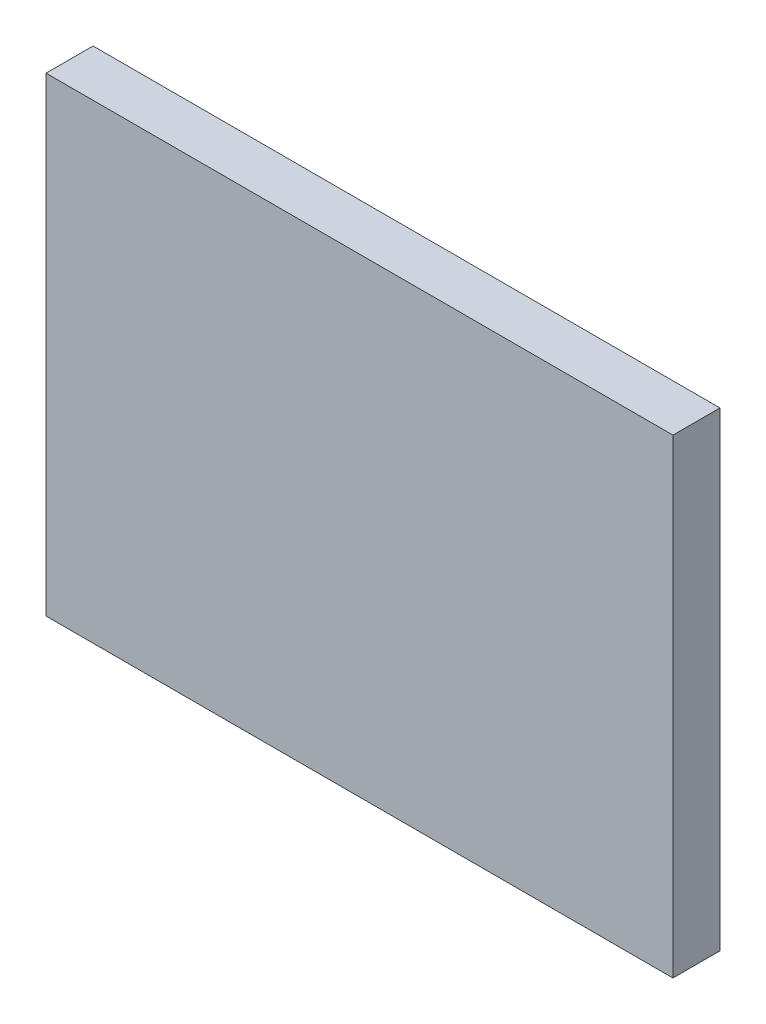
ISO-10303-21;
HEADER;
FILE_DESCRIPTION(('STEP AP214'),'2;1');
FILE_NAME('part.step','',(''),(''),'','','');
FILE_SCHEMA(('AUTOMOTIVE_DESIGN { 1 0 10303 214 1 1 1 1 }'));
ENDSEC;
DATA;
#1=APPLICATION_CONTEXT('core data for automotive mechanical design processes');
#2=APPLICATION_PROTOCOL_DEFINITION('international standard','automotive_design',2000,#1);
#3=PRODUCT_CONTEXT('',#1,'mechanical');
#4=PRODUCT('Part','Part','',(#3));
#5=PRODUCT_RELATED_PRODUCT_CATEGORY('part','',(#4));
#6=PRODUCT_DEFINITION_FORMATION('','',#4);
#7=PRODUCT_DEFINITION_CONTEXT('part definition',#1,'design');
#8=PRODUCT_DEFINITION('design','',#6,#7);
#9=PRODUCT_DEFINITION_SHAPE('','',#8);
#10=(LENGTH_UNIT() NAMED_UNIT(*) SI_UNIT(.MILLI.,.METRE.));
#11=(NAMED_UNIT(*) PLANE_ANGLE_UNIT() SI_UNIT($,.RADIAN.));
#12=(NAMED_UNIT(*) SI_UNIT($,.STERADIAN.) SOLID_ANGLE_UNIT());
#13=UNCERTAINTY_MEASURE_WITH_UNIT(LENGTH_MEASURE(1.E-05),#10,'distance_accuracy_value','');
#14=(GEOMETRIC_REPRESENTATION_CONTEXT(3) GLOBAL_UNCERTAINTY_ASSIGNED_CONTEXT((#13)) GLOBAL_UNIT_ASSIGNED_CONTEXT((#10,
#11,#12)) REPRESENTATION_CONTEXT('',''));
#15=CARTESIAN_POINT('',(0.,0.,0.));
#16=DIRECTION('',(0.,0.,1.));
#17=DIRECTION('',(1.,0.,0.));
#18=AXIS2_PLACEMENT_3D('',#15,#16,#17);
#19=CARTESIAN_POINT('',(-20.,-15.,3.));
#20=DIRECTION('',(1.,0.,0.));
#21=DIRECTION('',(0.,0.,-1.));
#22=AXIS2_PLACEMENT_3D('',#19,#20,#21);
#23=PLANE('',#22);
#24=DIRECTION('',(0.,-1.,0.));
#25=VECTOR('',#24,1.);
#26=CARTESIAN_POINT('',(-20.,-15.,0.));
#27=LINE('',#26,#25);
#28=CARTESIAN_POINT('',(-20.,15.,0.));
#29=VERTEX_POINT('',#28);
#30=CARTESIAN_POINT('',(-20.,-15.,0.));
#31=VERTEX_POINT('',#30);
#32=EDGE_CURVE('E102',#29,#31,#27,.T.);
#33=ORIENTED_EDGE('',*,*,#32,.T.);
#34=DIRECTION('',(0.,0.,-1.));
#35=VECTOR('',#34,1.);
#36=CARTESIAN_POINT('',(-20.,-15.,3.));
#37=LINE('',#36,#35);
#38=CARTESIAN_POINT('',(-20.,-15.,3.));
#39=VERTEX_POINT('',#38);
#40=EDGE_CURVE('E11',#39,#31,#37,.T.);
#41=ORIENTED_EDGE('',*,*,#40,.F.);
#42=DIRECTION('',(0.,-1.,0.));
#43=VECTOR('',#42,1.);
#44=CARTESIAN_POINT('',(-20.,-15.,3.));
#45=LINE('',#44,#43);
#46=CARTESIAN_POINT('',(-20.,15.,3.));
#47=VERTEX_POINT('',#46);
#48=EDGE_CURVE('E90',#47,#39,#45,.T.);
#49=ORIENTED_EDGE('',*,*,#48,.F.);
#50=DIRECTION('',(0.,0.,-1.));
#51=VECTOR('',#50,1.);
#52=CARTESIAN_POINT('',(-20.,15.,3.));
#53=LINE('',#52,#51);
#54=EDGE_CURVE('E98',#47,#29,#53,.T.);
#55=ORIENTED_EDGE('',*,*,#54,.T.);
#56=EDGE_LOOP('',(#33,#41,#49,#55));
#57=FACE_BOUND('',#56,.T.);
#58=ADVANCED_FACE('F39',(#57),#23,.F.);
#59=CARTESIAN_POINT('',(-20.,-15.,3.));
#60=DIRECTION('',(0.,1.,0.));
#61=DIRECTION('',(0.,0.,1.));
#62=AXIS2_PLACEMENT_3D('',#59,#60,#61);
#63=PLANE('',#62);
#64=DIRECTION('',(1.,0.,0.));
#65=VECTOR('',#64,1.);
#66=CARTESIAN_POINT('',(-20.,-15.,0.));
#67=LINE('',#66,#65);
#68=CARTESIAN_POINT('',(20.,-15.,0.));
#69=VERTEX_POINT('',#68);
#70=EDGE_CURVE('E94',#31,#69,#67,.T.);
#71=ORIENTED_EDGE('',*,*,#70,.T.);
#72=DIRECTION('',(0.,0.,-1.));
#73=VECTOR('',#72,1.);
#74=CARTESIAN_POINT('',(20.,-15.,3.));
#75=LINE('',#74,#73);
#76=CARTESIAN_POINT('',(20.,-15.,3.));
#77=VERTEX_POINT('',#76);
#78=EDGE_CURVE('E47',#77,#69,#75,.T.);
#79=ORIENTED_EDGE('',*,*,#78,.F.);
#80=DIRECTION('',(1.,0.,0.));
#81=VECTOR('',#80,1.);
#82=CARTESIAN_POINT('',(-20.,-15.,3.));
#83=LINE('',#82,#81);
#84=EDGE_CURVE('E85',#39,#77,#83,.T.);
#85=ORIENTED_EDGE('',*,*,#84,.F.);
#86=ORIENTED_EDGE('',*,*,#40,.T.);
#87=EDGE_LOOP('',(#71,#79,#85,#86));
#88=FACE_BOUND('',#87,.T.);
#89=ADVANCED_FACE('F93',(#88),#63,.F.);
#90=CARTESIAN_POINT('',(20.,-15.,3.));
#91=DIRECTION('',(-1.,0.,0.));
#92=DIRECTION('',(0.,0.,1.));
#93=AXIS2_PLACEMENT_3D('',#90,#91,#92);
#94=PLANE('',#93);
#95=DIRECTION('',(0.,1.,0.));
#96=VECTOR('',#95,1.);
#97=CARTESIAN_POINT('',(20.,-15.,0.));
#98=LINE('',#97,#96);
#99=CARTESIAN_POINT('',(20.,15.,0.));
#100=VERTEX_POINT('',#99);
#101=EDGE_CURVE('E72',#69,#100,#98,.T.);
#102=ORIENTED_EDGE('',*,*,#101,.T.);
#103=DIRECTION('',(0.,0.,-1.));
#104=VECTOR('',#103,1.);
#105=CARTESIAN_POINT('',(20.,15.,3.));
#106=LINE('',#105,#104);
#107=CARTESIAN_POINT('',(20.,15.,3.));
#108=VERTEX_POINT('',#107);
#109=EDGE_CURVE('E95',#108,#100,#106,.T.);
#110=ORIENTED_EDGE('',*,*,#109,.F.);
#111=DIRECTION('',(0.,1.,0.));
#112=VECTOR('',#111,1.);
#113=CARTESIAN_POINT('',(20.,-15.,3.));
#114=LINE('',#113,#112);
#115=EDGE_CURVE('E88',#77,#108,#114,.T.);
#116=ORIENTED_EDGE('',*,*,#115,.F.);
#117=ORIENTED_EDGE('',*,*,#78,.T.);
#118=EDGE_LOOP('',(#102,#110,#116,#117));
#119=FACE_BOUND('',#118,.T.);
#120=ADVANCED_FACE('F96',(#119),#94,.F.);
#121=CARTESIAN_POINT('',(-20.,15.,3.));
#122=DIRECTION('',(0.,-1.,0.));
#123=DIRECTION('',(0.,0.,-1.));
#124=AXIS2_PLACEMENT_3D('',#121,#122,#123);
#125=PLANE('',#124);
#126=DIRECTION('',(-1.,0.,0.));
#127=VECTOR('',#126,1.);
#128=CARTESIAN_POINT('',(-20.,15.,0.));
#129=LINE('',#128,#127);
#130=EDGE_CURVE('E78',#100,#29,#129,.T.);
#131=ORIENTED_EDGE('',*,*,#130,.T.);
#132=ORIENTED_EDGE('',*,*,#54,.F.);
#133=DIRECTION('',(-1.,0.,0.));
#134=VECTOR('',#133,1.);
#135=CARTESIAN_POINT('',(-20.,15.,3.));
#136=LINE('',#135,#134);
#137=EDGE_CURVE('E55',#108,#47,#136,.T.);
#138=ORIENTED_EDGE('',*,*,#137,.F.);
#139=ORIENTED_EDGE('',*,*,#109,.T.);
#140=EDGE_LOOP('',(#131,#132,#138,#139));
#141=FACE_BOUND('',#140,.T.);
#142=ADVANCED_FACE('F109',(#141),#125,.F.);
#143=CARTESIAN_POINT('',(0.,0.,3.));
#144=DIRECTION('',(0.,0.,-1.));
#145=DIRECTION('',(-1.,0.,0.));
#146=AXIS2_PLACEMENT_3D('',#143,#144,#145);
#147=PLANE('',#146);
#148=ORIENTED_EDGE('',*,*,#48,.T.);
#149=ORIENTED_EDGE('',*,*,#84,.T.);
#150=ORIENTED_EDGE('',*,*,#115,.T.);
#151=ORIENTED_EDGE('',*,*,#137,.T.);
#152=EDGE_LOOP('',(#148,#149,#150,#151));
#153=FACE_BOUND('',#152,.T.);
#154=ADVANCED_FACE('F86',(#153),#147,.F.);
#155=CARTESIAN_POINT('',(0.,0.,0.));
#156=DIRECTION('',(0.,0.,-1.));
#157=DIRECTION('',(-1.,0.,0.));
#158=AXIS2_PLACEMENT_3D('',#155,#156,#157);
#159=PLANE('',#158);
#160=ORIENTED_EDGE('',*,*,#32,.F.);
#161=ORIENTED_EDGE('',*,*,#130,.F.);
#162=ORIENTED_EDGE('',*,*,#101,.F.);
#163=ORIENTED_EDGE('',*,*,#70,.F.);
#164=EDGE_LOOP('',(#160,#161,#162,#163));
#165=FACE_BOUND('',#164,.T.);
#166=ADVANCED_FACE('F112',(#165),#159,.T.);
#167=CLOSED_SHELL('',(#58,#89,#120,#142,#154,#166));
#168=MANIFOLD_SOLID_BREP('B2',#167);
#169=ADVANCED_BREP_SHAPE_REPRESENTATION('',(#18,#168),#14);
#170=SHAPE_DEFINITION_REPRESENTATION(#9,#169);
ENDSEC;
END-ISO-10303-21;
